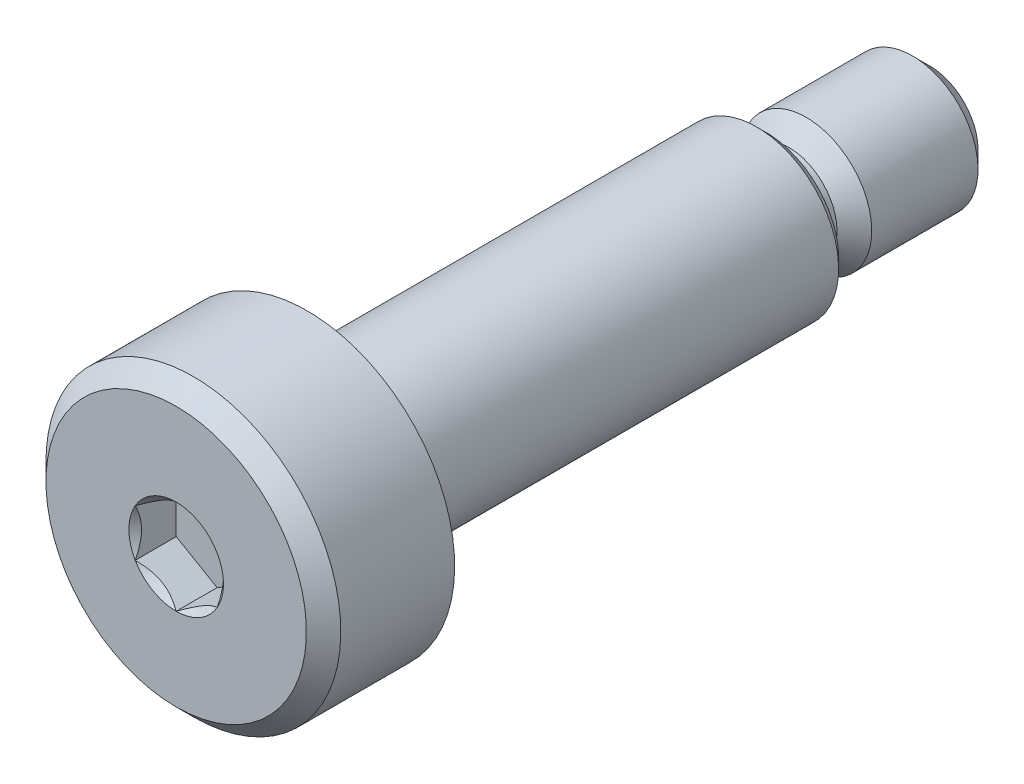
ISO-10303-21;
HEADER;
FILE_DESCRIPTION(('STEP AP214'),'2;1');
FILE_NAME('part.step','',(''),(''),'','','');
FILE_SCHEMA(('AUTOMOTIVE_DESIGN { 1 0 10303 214 1 1 1 1 }'));
ENDSEC;
DATA;
#1=APPLICATION_CONTEXT('core data for automotive mechanical design processes');
#2=APPLICATION_PROTOCOL_DEFINITION('international standard','automotive_design',2000,#1);
#3=PRODUCT_CONTEXT('',#1,'mechanical');
#4=PRODUCT('Part','Part','',(#3));
#5=PRODUCT_RELATED_PRODUCT_CATEGORY('part','',(#4));
#6=PRODUCT_DEFINITION_FORMATION('','',#4);
#7=PRODUCT_DEFINITION_CONTEXT('part definition',#1,'design');
#8=PRODUCT_DEFINITION('design','',#6,#7);
#9=PRODUCT_DEFINITION_SHAPE('','',#8);
#10=(LENGTH_UNIT() NAMED_UNIT(*) SI_UNIT(.MILLI.,.METRE.));
#11=(NAMED_UNIT(*) PLANE_ANGLE_UNIT() SI_UNIT($,.RADIAN.));
#12=(NAMED_UNIT(*) SI_UNIT($,.STERADIAN.) SOLID_ANGLE_UNIT());
#13=UNCERTAINTY_MEASURE_WITH_UNIT(LENGTH_MEASURE(1.E-05),#10,'distance_accuracy_value','');
#14=(GEOMETRIC_REPRESENTATION_CONTEXT(3) GLOBAL_UNCERTAINTY_ASSIGNED_CONTEXT((#13)) GLOBAL_UNIT_ASSIGNED_CONTEXT((#10,
#11,#12)) REPRESENTATION_CONTEXT('',''));
#15=CARTESIAN_POINT('',(0.,0.,0.));
#16=DIRECTION('',(0.,0.,1.));
#17=DIRECTION('',(1.,0.,0.));
#18=AXIS2_PLACEMENT_3D('',#15,#16,#17);
#19=CARTESIAN_POINT('',(0.,3.975,11.5));
#20=DIRECTION('',(0.,0.,-1.));
#21=DIRECTION('',(0.,1.,0.));
#22=AXIS2_PLACEMENT_3D('',#19,#20,#21);
#23=PLANE('',#22);
#24=CARTESIAN_POINT('',(0.,0.,11.5));
#25=DIRECTION('',(0.,0.,1.));
#26=DIRECTION('',(1.,0.,0.));
#27=AXIS2_PLACEMENT_3D('',#24,#25,#26);
#28=CIRCLE('',#27,1.44337567297406);
#29=CARTESIAN_POINT('',(0.,1.44337567297406,11.5));
#30=VERTEX_POINT('',#29);
#31=CARTESIAN_POINT('',(-1.24999999999998,0.721687836487042,11.5));
#32=VERTEX_POINT('',#31);
#33=EDGE_CURVE('E286',#30,#32,#28,.T.);
#34=ORIENTED_EDGE('',*,*,#33,.F.);
#35=CARTESIAN_POINT('',(1.25,0.721687836487011,11.5));
#36=VERTEX_POINT('',#35);
#37=EDGE_CURVE('E289',#36,#30,#28,.T.);
#38=ORIENTED_EDGE('',*,*,#37,.F.);
#39=CARTESIAN_POINT('',(1.25000000000002,-0.72168783648702,11.5));
#40=VERTEX_POINT('',#39);
#41=EDGE_CURVE('E48',#40,#36,#28,.T.);
#42=ORIENTED_EDGE('',*,*,#41,.F.);
#43=CARTESIAN_POINT('',(0.,-1.44337567297408,11.5));
#44=VERTEX_POINT('',#43);
#45=EDGE_CURVE('E55',#44,#40,#28,.T.);
#46=ORIENTED_EDGE('',*,*,#45,.F.);
#47=CARTESIAN_POINT('',(-1.25,-0.721687836487051,11.5));
#48=VERTEX_POINT('',#47);
#49=EDGE_CURVE('E294',#48,#44,#28,.T.);
#50=ORIENTED_EDGE('',*,*,#49,.F.);
#51=EDGE_CURVE('E291',#32,#48,#28,.T.);
#52=ORIENTED_EDGE('',*,*,#51,.F.);
#53=EDGE_LOOP('',(#34,#38,#42,#46,#50,#52));
#54=FACE_BOUND('',#53,.T.);
#55=CARTESIAN_POINT('',(0.,0.,11.5));
#56=DIRECTION('',(0.,0.,1.));
#57=DIRECTION('',(0.,-1.,0.));
#58=AXIS2_PLACEMENT_3D('',#55,#56,#57);
#59=CIRCLE('',#58,3.97500000000001);
#60=CARTESIAN_POINT('',(0.,-3.97500000000002,11.5));
#61=VERTEX_POINT('',#60);
#62=EDGE_CURVE('E11',#61,#61,#59,.T.);
#63=ORIENTED_EDGE('',*,*,#62,.T.);
#64=EDGE_LOOP('',(#63));
#65=FACE_BOUND('',#64,.T.);
#66=ADVANCED_FACE('F35',(#54,#65),#23,.F.);
#67=CARTESIAN_POINT('',(0.,0.,10.975));
#68=DIRECTION('',(0.,0.,-1.));
#69=DIRECTION('',(0.,1.,0.));
#70=AXIS2_PLACEMENT_3D('',#67,#68,#69);
#71=CONICAL_SURFACE('',#70,4.50000000000001,0.785398163397443);
#72=ORIENTED_EDGE('',*,*,#62,.F.);
#73=EDGE_LOOP('',(#72));
#74=FACE_BOUND('',#73,.T.);
#75=CARTESIAN_POINT('',(0.,0.,10.975));
#76=DIRECTION('',(0.,0.,1.));
#77=DIRECTION('',(0.,-1.,0.));
#78=AXIS2_PLACEMENT_3D('',#75,#76,#77);
#79=CIRCLE('',#78,4.50000000000001);
#80=CARTESIAN_POINT('',(0.,-4.50000000000002,10.975));
#81=VERTEX_POINT('',#80);
#82=EDGE_CURVE('E42',#81,#81,#79,.T.);
#83=ORIENTED_EDGE('',*,*,#82,.T.);
#84=EDGE_LOOP('',(#83));
#85=FACE_BOUND('',#84,.T.);
#86=ADVANCED_FACE('F185',(#74,#85),#71,.T.);
#87=CARTESIAN_POINT('',(0.,0.,11.5));
#88=DIRECTION('',(0.,0.,1.));
#89=DIRECTION('',(0.,-1.,0.));
#90=AXIS2_PLACEMENT_3D('',#87,#88,#89);
#91=CYLINDRICAL_SURFACE('',#90,4.50000000000001);
#92=ORIENTED_EDGE('',*,*,#82,.F.);
#93=EDGE_LOOP('',(#92));
#94=FACE_BOUND('',#93,.T.);
#95=CARTESIAN_POINT('',(0.,0.,7.5));
#96=DIRECTION('',(0.,0.,1.));
#97=DIRECTION('',(0.,-1.,0.));
#98=AXIS2_PLACEMENT_3D('',#95,#96,#97);
#99=CIRCLE('',#98,4.50000000000001);
#100=CARTESIAN_POINT('',(0.,-4.50000000000002,7.5));
#101=VERTEX_POINT('',#100);
#102=EDGE_CURVE('E180',#101,#101,#99,.T.);
#103=ORIENTED_EDGE('',*,*,#102,.T.);
#104=EDGE_LOOP('',(#103));
#105=FACE_BOUND('',#104,.T.);
#106=ADVANCED_FACE('F187',(#94,#105),#91,.T.);
#107=CARTESIAN_POINT('',(0.,4.5,7.5));
#108=DIRECTION('',(0.,0.,1.));
#109=DIRECTION('',(0.,-1.,0.));
#110=AXIS2_PLACEMENT_3D('',#107,#108,#109);
#111=PLANE('',#110);
#112=ORIENTED_EDGE('',*,*,#102,.F.);
#113=EDGE_LOOP('',(#112));
#114=FACE_BOUND('',#113,.T.);
#115=CARTESIAN_POINT('',(0.,0.,7.5));
#116=DIRECTION('',(0.,0.,1.));
#117=DIRECTION('',(0.,-1.,0.));
#118=AXIS2_PLACEMENT_3D('',#115,#116,#117);
#119=CIRCLE('',#118,2.50000000000001);
#120=CARTESIAN_POINT('',(0.,-2.50000000000002,7.5));
#121=VERTEX_POINT('',#120);
#122=EDGE_CURVE('E177',#121,#121,#119,.T.);
#123=ORIENTED_EDGE('',*,*,#122,.T.);
#124=EDGE_LOOP('',(#123));
#125=FACE_BOUND('',#124,.T.);
#126=ADVANCED_FACE('F190',(#114,#125),#111,.F.);
#127=CARTESIAN_POINT('',(0.,0.,7.26666666666667));
#128=DIRECTION('',(0.,0.,1.));
#129=DIRECTION('',(0.,-1.,0.));
#130=AXIS2_PLACEMENT_3D('',#127,#128,#129);
#131=TOROIDAL_SURFACE('',#130,2.50000000000001,0.233333333333333);
#132=ORIENTED_EDGE('',*,*,#122,.F.);
#133=EDGE_LOOP('',(#132));
#134=FACE_BOUND('',#133,.T.);
#135=CARTESIAN_POINT('',(0.,0.,7.26666666666667));
#136=DIRECTION('',(0.,0.,1.));
#137=DIRECTION('',(0.,-1.,0.));
#138=AXIS2_PLACEMENT_3D('',#135,#136,#137);
#139=CIRCLE('',#138,2.26666666666667);
#140=CARTESIAN_POINT('',(0.,-2.26666666666668,7.26666666666667));
#141=VERTEX_POINT('',#140);
#142=EDGE_CURVE('E174',#141,#141,#139,.T.);
#143=ORIENTED_EDGE('',*,*,#142,.T.);
#144=EDGE_LOOP('',(#143));
#145=FACE_BOUND('',#144,.T.);
#146=ADVANCED_FACE('F196',(#134,#145),#131,.F.);
#147=CARTESIAN_POINT('',(0.,0.,11.5));
#148=DIRECTION('',(0.,0.,1.));
#149=DIRECTION('',(0.,-1.,0.));
#150=AXIS2_PLACEMENT_3D('',#147,#148,#149);
#151=CYLINDRICAL_SURFACE('',#150,2.26666666666667);
#152=ORIENTED_EDGE('',*,*,#142,.F.);
#153=EDGE_LOOP('',(#152));
#154=FACE_BOUND('',#153,.T.);
#155=CARTESIAN_POINT('',(0.,0.,6.8));
#156=DIRECTION('',(0.,0.,1.));
#157=DIRECTION('',(0.,-1.,0.));
#158=AXIS2_PLACEMENT_3D('',#155,#156,#157);
#159=CIRCLE('',#158,2.26666666666667);
#160=CARTESIAN_POINT('',(0.,-2.26666666666668,6.8));
#161=VERTEX_POINT('',#160);
#162=EDGE_CURVE('E171',#161,#161,#159,.T.);
#163=ORIENTED_EDGE('',*,*,#162,.T.);
#164=EDGE_LOOP('',(#163));
#165=FACE_BOUND('',#164,.T.);
#166=ADVANCED_FACE('F202',(#154,#165),#151,.T.);
#167=CARTESIAN_POINT('',(0.,0.,6.66528493718909));
#168=DIRECTION('',(0.,0.,-1.));
#169=DIRECTION('',(0.,1.,0.));
#170=AXIS2_PLACEMENT_3D('',#167,#168,#169);
#171=CONICAL_SURFACE('',#170,2.50000000000001,1.0471975511966);
#172=ORIENTED_EDGE('',*,*,#162,.F.);
#173=EDGE_LOOP('',(#172));
#174=FACE_BOUND('',#173,.T.);
#175=CARTESIAN_POINT('',(0.,0.,6.66528493718909));
#176=DIRECTION('',(0.,0.,1.));
#177=DIRECTION('',(0.,-1.,0.));
#178=AXIS2_PLACEMENT_3D('',#175,#176,#177);
#179=CIRCLE('',#178,2.50000000000001);
#180=CARTESIAN_POINT('',(0.,-2.50000000000002,6.66528493718909));
#181=VERTEX_POINT('',#180);
#182=EDGE_CURVE('E168',#181,#181,#179,.T.);
#183=ORIENTED_EDGE('',*,*,#182,.T.);
#184=EDGE_LOOP('',(#183));
#185=FACE_BOUND('',#184,.T.);
#186=ADVANCED_FACE('F208',(#174,#185),#171,.T.);
#187=CARTESIAN_POINT('',(0.,0.,11.5));
#188=DIRECTION('',(0.,0.,1.));
#189=DIRECTION('',(0.,-1.,0.));
#190=AXIS2_PLACEMENT_3D('',#187,#188,#189);
#191=CYLINDRICAL_SURFACE('',#190,2.50000000000001);
#192=ORIENTED_EDGE('',*,*,#182,.F.);
#193=EDGE_LOOP('',(#192));
#194=FACE_BOUND('',#193,.T.);
#195=CARTESIAN_POINT('',(0.,0.,-6.22));
#196=DIRECTION('',(0.,0.,1.));
#197=DIRECTION('',(0.,-1.,0.));
#198=AXIS2_PLACEMENT_3D('',#195,#196,#197);
#199=CIRCLE('',#198,2.50000000000001);
#200=CARTESIAN_POINT('',(0.,-2.50000000000001,-6.22));
#201=VERTEX_POINT('',#200);
#202=EDGE_CURVE('E165',#201,#201,#199,.T.);
#203=ORIENTED_EDGE('',*,*,#202,.T.);
#204=EDGE_LOOP('',(#203));
#205=FACE_BOUND('',#204,.T.);
#206=ADVANCED_FACE('F214',(#194,#205),#191,.T.);
#207=CARTESIAN_POINT('',(0.,0.,-6.5));
#208=DIRECTION('',(0.,0.,1.));
#209=DIRECTION('',(0.,-1.,0.));
#210=AXIS2_PLACEMENT_3D('',#207,#208,#209);
#211=CONICAL_SURFACE('',#210,2.22000000000001,0.785398163397445);
#212=ORIENTED_EDGE('',*,*,#202,.F.);
#213=EDGE_LOOP('',(#212));
#214=FACE_BOUND('',#213,.T.);
#215=CARTESIAN_POINT('',(0.,0.,-6.5));
#216=DIRECTION('',(0.,0.,1.));
#217=DIRECTION('',(0.,-1.,0.));
#218=AXIS2_PLACEMENT_3D('',#215,#216,#217);
#219=CIRCLE('',#218,2.22000000000001);
#220=CARTESIAN_POINT('',(0.,-2.22000000000001,-6.5));
#221=VERTEX_POINT('',#220);
#222=EDGE_CURVE('E162',#221,#221,#219,.T.);
#223=ORIENTED_EDGE('',*,*,#222,.T.);
#224=EDGE_LOOP('',(#223));
#225=FACE_BOUND('',#224,.T.);
#226=ADVANCED_FACE('F220',(#214,#225),#211,.T.);
#227=CARTESIAN_POINT('',(0.,1.81955944018203,-6.5));
#228=DIRECTION('',(0.,0.,1.));
#229=DIRECTION('',(0.,-1.,0.));
#230=AXIS2_PLACEMENT_3D('',#227,#228,#229);
#231=PLANE('',#230);
#232=ORIENTED_EDGE('',*,*,#222,.F.);
#233=EDGE_LOOP('',(#232));
#234=FACE_BOUND('',#233,.T.);
#235=CARTESIAN_POINT('',(0.,0.,-6.5));
#236=DIRECTION('',(0.,0.,1.));
#237=DIRECTION('',(0.,-1.,0.));
#238=AXIS2_PLACEMENT_3D('',#235,#236,#237);
#239=CIRCLE('',#238,1.81955944018204);
#240=CARTESIAN_POINT('',(0.,-1.81955944018205,-6.5));
#241=VERTEX_POINT('',#240);
#242=EDGE_CURVE('E159',#241,#241,#239,.T.);
#243=ORIENTED_EDGE('',*,*,#242,.T.);
#244=EDGE_LOOP('',(#243));
#245=FACE_BOUND('',#244,.T.);
#246=ADVANCED_FACE('F226',(#234,#245),#231,.F.);
#247=CARTESIAN_POINT('',(0.,0.,-6.85));
#248=DIRECTION('',(0.,0.,1.));
#249=DIRECTION('',(0.,-1.,0.));
#250=AXIS2_PLACEMENT_3D('',#247,#248,#249);
#251=TOROIDAL_SURFACE('',#250,1.81955944018204,0.349999999999999);
#252=ORIENTED_EDGE('',*,*,#242,.F.);
#253=EDGE_LOOP('',(#252));
#254=FACE_BOUND('',#253,.T.);
#255=CARTESIAN_POINT('',(0.,0.,-6.85));
#256=DIRECTION('',(0.,0.,1.));
#257=DIRECTION('',(0.,-1.,0.));
#258=AXIS2_PLACEMENT_3D('',#255,#256,#257);
#259=CIRCLE('',#258,1.46955944018204);
#260=CARTESIAN_POINT('',(0.,-1.46955944018205,-6.85));
#261=VERTEX_POINT('',#260);
#262=EDGE_CURVE('E156',#261,#261,#259,.T.);
#263=ORIENTED_EDGE('',*,*,#262,.T.);
#264=EDGE_LOOP('',(#263));
#265=FACE_BOUND('',#264,.T.);
#266=ADVANCED_FACE('F232',(#254,#265),#251,.F.);
#267=CARTESIAN_POINT('',(0.,0.,11.5));
#268=DIRECTION('',(0.,0.,1.));
#269=DIRECTION('',(0.,-1.,0.));
#270=AXIS2_PLACEMENT_3D('',#267,#268,#269);
#271=CYLINDRICAL_SURFACE('',#270,1.46955944018204);
#272=ORIENTED_EDGE('',*,*,#262,.F.);
#273=EDGE_LOOP('',(#272));
#274=FACE_BOUND('',#273,.T.);
#275=CARTESIAN_POINT('',(0.,0.,-7.2));
#276=DIRECTION('',(0.,0.,1.));
#277=DIRECTION('',(0.,-1.,0.));
#278=AXIS2_PLACEMENT_3D('',#275,#276,#277);
#279=CIRCLE('',#278,1.46955944018204);
#280=CARTESIAN_POINT('',(0.,-1.46955944018205,-7.2));
#281=VERTEX_POINT('',#280);
#282=EDGE_CURVE('E153',#281,#281,#279,.T.);
#283=ORIENTED_EDGE('',*,*,#282,.T.);
#284=EDGE_LOOP('',(#283));
#285=FACE_BOUND('',#284,.T.);
#286=ADVANCED_FACE('F238',(#274,#285),#271,.T.);
#287=CARTESIAN_POINT('',(0.,0.,-7.73044055981796));
#288=DIRECTION('',(0.,0.,-1.));
#289=DIRECTION('',(0.,1.,0.));
#290=AXIS2_PLACEMENT_3D('',#287,#288,#289);
#291=CONICAL_SURFACE('',#290,2.,0.785398163397445);
#292=ORIENTED_EDGE('',*,*,#282,.F.);
#293=EDGE_LOOP('',(#292));
#294=FACE_BOUND('',#293,.T.);
#295=CARTESIAN_POINT('',(0.,0.,-7.73044055981796));
#296=DIRECTION('',(0.,0.,1.));
#297=DIRECTION('',(0.,-1.,0.));
#298=AXIS2_PLACEMENT_3D('',#295,#296,#297);
#299=CIRCLE('',#298,2.);
#300=CARTESIAN_POINT('',(0.,-2.00000000000001,-7.73044055981797));
#301=VERTEX_POINT('',#300);
#302=EDGE_CURVE('E150',#301,#301,#299,.T.);
#303=ORIENTED_EDGE('',*,*,#302,.T.);
#304=EDGE_LOOP('',(#303));
#305=FACE_BOUND('',#304,.T.);
#306=ADVANCED_FACE('F244',(#294,#305),#291,.T.);
#307=CARTESIAN_POINT('',(0.,0.,11.5));
#308=DIRECTION('',(0.,0.,1.));
#309=DIRECTION('',(0.,-1.,0.));
#310=AXIS2_PLACEMENT_3D('',#307,#308,#309);
#311=CYLINDRICAL_SURFACE('',#310,2.);
#312=ORIENTED_EDGE('',*,*,#302,.F.);
#313=EDGE_LOOP('',(#312));
#314=FACE_BOUND('',#313,.T.);
#315=CARTESIAN_POINT('',(0.,0.,-10.975));
#316=DIRECTION('',(0.,0.,1.));
#317=DIRECTION('',(0.,-1.,0.));
#318=AXIS2_PLACEMENT_3D('',#315,#316,#317);
#319=CIRCLE('',#318,2.);
#320=CARTESIAN_POINT('',(0.,-2.,-10.975));
#321=VERTEX_POINT('',#320);
#322=EDGE_CURVE('E147',#321,#321,#319,.T.);
#323=ORIENTED_EDGE('',*,*,#322,.T.);
#324=EDGE_LOOP('',(#323));
#325=FACE_BOUND('',#324,.T.);
#326=ADVANCED_FACE('F250',(#314,#325),#311,.T.);
#327=CARTESIAN_POINT('',(0.,0.,-11.5));
#328=DIRECTION('',(0.,0.,1.));
#329=DIRECTION('',(0.,-1.,0.));
#330=AXIS2_PLACEMENT_3D('',#327,#328,#329);
#331=CONICAL_SURFACE('',#330,1.475,0.785398163397443);
#332=ORIENTED_EDGE('',*,*,#322,.F.);
#333=EDGE_LOOP('',(#332));
#334=FACE_BOUND('',#333,.T.);
#335=CARTESIAN_POINT('',(0.,0.,-11.5));
#336=DIRECTION('',(0.,0.,1.));
#337=DIRECTION('',(0.,-1.,0.));
#338=AXIS2_PLACEMENT_3D('',#335,#336,#337);
#339=CIRCLE('',#338,1.475);
#340=CARTESIAN_POINT('',(0.,-1.47500000000001,-11.5));
#341=VERTEX_POINT('',#340);
#342=EDGE_CURVE('E134',#341,#341,#339,.T.);
#343=ORIENTED_EDGE('',*,*,#342,.T.);
#344=EDGE_LOOP('',(#343));
#345=FACE_BOUND('',#344,.T.);
#346=ADVANCED_FACE('F256',(#334,#345),#331,.T.);
#347=CARTESIAN_POINT('',(0.,0.,-11.5));
#348=DIRECTION('',(0.,0.,1.));
#349=DIRECTION('',(0.,-1.,0.));
#350=AXIS2_PLACEMENT_3D('',#347,#348,#349);
#351=PLANE('',#350);
#352=ORIENTED_EDGE('',*,*,#342,.F.);
#353=EDGE_LOOP('',(#352));
#354=FACE_BOUND('',#353,.T.);
#355=ADVANCED_FACE('F262',(#354),#351,.F.);
#356=CARTESIAN_POINT('',(0.,0.,11.5));
#357=DIRECTION('',(0.,0.,1.));
#358=DIRECTION('',(1.,0.,0.));
#359=AXIS2_PLACEMENT_3D('',#356,#357,#358);
#360=CONICAL_SURFACE('',#359,1.44337567297406,0.78539816339745);
#361=ORIENTED_EDGE('',*,*,#33,.T.);
#362=CARTESIAN_POINT('',(0.000199999999998604,1.4434911430279,11.5001154839092));
#363=CARTESIAN_POINT('',(-0.0427751670715886,1.41867941875065,11.4753216680551));
#364=CARTESIAN_POINT('',(-0.0864690047459502,1.39345276980743,11.4519837344187));
#365=CARTESIAN_POINT('',(-0.175565930841945,1.34201263554194,11.4092520040846));
#366=CARTESIAN_POINT('',(-0.220977498357067,1.31579425481276,11.3898819923604));
#367=CARTESIAN_POINT('',(-0.312547820935264,1.26292610442246,11.3567004834135));
#368=CARTESIAN_POINT('',(-0.35868324017589,1.23628980770471,11.3428055590527));
#369=CARTESIAN_POINT('',(-0.451970080407597,1.18243062538508,11.3213972821607));
#370=CARTESIAN_POINT('',(-0.499118649136385,1.15520938653761,11.3138679415668));
#371=CARTESIAN_POINT('',(-0.580373556887258,1.10829684367466,11.3070744980507));
#372=CARTESIAN_POINT('',(-0.614374876627947,1.08866617256957,11.3060685591044));
#373=CARTESIAN_POINT('',(-0.682317764432485,1.0494393280061,11.3077614149113));
#374=CARTESIAN_POINT('',(-0.716259317655665,1.02984316311599,11.3104610272156));
#375=CARTESIAN_POINT('',(-0.783814856457508,0.990839954603493,11.3194089303164));
#376=CARTESIAN_POINT('',(-0.817428507286784,0.971433104248764,11.3256605258997));
#377=CARTESIAN_POINT('',(-0.884094638217823,0.932943395609898,11.3413756814139));
#378=CARTESIAN_POINT('',(-0.917146871030305,0.913860680098293,11.3508406200875));
#379=CARTESIAN_POINT('',(-1.00179969160027,0.864986351354561,11.3789313906876));
#380=CARTESIAN_POINT('',(-1.05286649242964,0.835502920149071,11.3996701574522));
#381=CARTESIAN_POINT('',(-1.15300085411326,0.777690319475905,11.4463871346715));
#382=CARTESIAN_POINT('',(-1.20207431157827,0.749357745598414,11.4723482959468));
#383=CARTESIAN_POINT('',(-1.2502,0.721572366433193,11.5001154839091));
#384=B_SPLINE_CURVE_WITH_KNOTS('',3,(#362,#363,#364,#365,#366,#367,#368,#369,#370,#371,#372,
#373,#374,#375,#376,#377,#378,#379,#380,#381,#382,#383),.UNSPECIFIED.,.F.,.F.,(4,2,2,2,2,2,2,2,
2,2,4),(0.,0.166533409618305,0.334037607289764,0.498880396489702,0.66330791924028,
0.780963963458833,0.898645970148461,1.01643764860774,1.13427993171551,1.32148652032141,
1.50809158792573),.UNSPECIFIED.);
#385=EDGE_CURVE('E293',#30,#32,#384,.T.);
#386=ORIENTED_EDGE('',*,*,#385,.F.);
#387=EDGE_LOOP('',(#361,#386));
#388=FACE_BOUND('',#387,.T.);
#389=ADVANCED_FACE('F267',(#388),#360,.F.);
#390=ORIENTED_EDGE('',*,*,#51,.T.);
#391=CARTESIAN_POINT('',(-1.25,-1.45844245505819,11.9774456083314));
#392=CARTESIAN_POINT('',(-1.25,-1.42301517782604,11.9505504331684));
#393=CARTESIAN_POINT('',(-1.25,-1.38739259471813,11.9239132721643));
#394=CARTESIAN_POINT('',(-1.25,-1.31567681688476,11.8712620842442));
#395=CARTESIAN_POINT('',(-1.25,-1.27958350821522,11.8452482126937));
#396=CARTESIAN_POINT('',(-1.25,-1.16994919906755,11.7679309253239));
#397=CARTESIAN_POINT('',(-1.25,-1.09559207117151,11.7177657157311));
#398=CARTESIAN_POINT('',(-1.25,-0.939543616744097,11.6191087372188));
#399=CARTESIAN_POINT('',(-1.25,-0.857678207866027,11.5708892555275));
#400=CARTESIAN_POINT('',(-1.25,-0.689834311085131,11.4825626076919));
#401=CARTESIAN_POINT('',(-1.25,-0.603870962043201,11.4424280706784));
#402=CARTESIAN_POINT('',(-1.25,-0.47502099054951,11.3933215537189));
#403=CARTESIAN_POINT('',(-1.25,-0.43408262636186,11.3792601333163));
#404=CARTESIAN_POINT('',(-1.25,-0.351200868158825,11.3544217225875));
#405=CARTESIAN_POINT('',(-1.25,-0.309257406716582,11.343644953281));
#406=CARTESIAN_POINT('',(-1.25,-0.22532618247008,11.3261206573077));
#407=CARTESIAN_POINT('',(-1.25,-0.183353314948822,11.319302916863));
#408=CARTESIAN_POINT('',(-1.25,-0.0989376095367877,11.3098328899205));
#409=CARTESIAN_POINT('',(-1.25,-0.0564948584126027,11.3071798468942));
#410=CARTESIAN_POINT('',(-1.25,0.0268119063323923,11.3062444970806));
#411=CARTESIAN_POINT('',(-1.25,0.0676741326530964,11.3077986975234));
#412=CARTESIAN_POINT('',(-1.25,0.149061479525303,11.3148272348816));
#413=CARTESIAN_POINT('',(-1.25,0.189586535119568,11.3203023102525));
#414=CARTESIAN_POINT('',(-1.25,0.27068678781888,11.3349634522043));
#415=CARTESIAN_POINT('',(-1.25,0.311250298408257,11.3442131770672));
#416=CARTESIAN_POINT('',(-1.25,0.391488499706744,11.3659262751041));
#417=CARTESIAN_POINT('',(-1.25,0.431163257835265,11.3783894036108));
#418=CARTESIAN_POINT('',(-1.25,0.555216398704208,11.4220700828824));
#419=CARTESIAN_POINT('',(-1.25,0.637851220281927,11.4582264978976));
#420=CARTESIAN_POINT('',(-1.25,0.799246338610346,11.5386395441542));
#421=CARTESIAN_POINT('',(-1.25,0.877991480837636,11.5829251047261));
#422=CARTESIAN_POINT('',(-1.25,1.02849676118733,11.6743156913958));
#423=CARTESIAN_POINT('',(-1.25,1.10040966869699,11.7211722627457));
#424=CARTESIAN_POINT('',(-1.25,1.20635851538069,11.7936186777052));
#425=CARTESIAN_POINT('',(-1.25,1.2412179871426,11.8180250606184));
#426=CARTESIAN_POINT('',(-1.25,1.31045998194067,11.8674862455047));
#427=CARTESIAN_POINT('',(-1.25,1.34484263274746,11.8925408684067));
#428=CARTESIAN_POINT('',(-1.25,1.37902663149297,11.9178643573194));
#429=B_SPLINE_CURVE_WITH_KNOTS('',3,(#391,#392,#393,#394,#395,#396,#397,#398,#399,#400,#401,
#402,#403,#404,#405,#406,#407,#408,#409,#410,#411,#412,#413,#414,#415,#416,#417,#418,#419,#420,
#421,#422,#423,#424,#425,#426,#427,#428),.UNSPECIFIED.,.F.,.F.,(4,2,2,2,2,2,2,2,2,2,2,2,2,2,2,2,
2,2,4),(0.,0.133435720650652,0.26690436349589,0.535877392907816,0.820681861155797,
1.10450531666899,1.23425377884955,1.36401096969689,1.49139047404654,1.61874683688834,
1.74122590042979,1.86372803767965,1.98838763303931,2.11303773966678,2.38284177069341,
2.65362525833967,2.91099066489612,3.03864814262749,3.16627072479097),.UNSPECIFIED.);
#430=EDGE_CURVE('E302',#32,#48,#429,.F.);
#431=ORIENTED_EDGE('',*,*,#430,.F.);
#432=EDGE_LOOP('',(#390,#431));
#433=FACE_BOUND('',#432,.T.);
#434=ADVANCED_FACE('F272',(#433),#360,.F.);
#435=ORIENTED_EDGE('',*,*,#49,.T.);
#436=CARTESIAN_POINT('',(-1.2502,-0.721572366433193,11.5001154839091));
#437=CARTESIAN_POINT('',(-1.20722483292841,-0.746384090710443,11.4753216680551));
#438=CARTESIAN_POINT('',(-1.16353099525405,-0.771610739653663,11.4519837344187));
#439=CARTESIAN_POINT('',(-1.07443406915806,-0.823050873919154,11.4092520040845));
#440=CARTESIAN_POINT('',(-1.02902250164293,-0.849269254648333,11.3898819923604));
#441=CARTESIAN_POINT('',(-0.937452179064736,-0.902137405038636,11.3567004834135));
#442=CARTESIAN_POINT('',(-0.891316759824109,-0.928773701756388,11.3428055590526));
#443=CARTESIAN_POINT('',(-0.798029919592401,-0.982632884076014,11.3213972821606));
#444=CARTESIAN_POINT('',(-0.750881350863613,-1.00985412292349,11.3138679415668));
#445=CARTESIAN_POINT('',(-0.669626443112741,-1.05676666578643,11.3070744980507));
#446=CARTESIAN_POINT('',(-0.635625123372053,-1.07639733689152,11.3060685591043));
#447=CARTESIAN_POINT('',(-0.567682235567517,-1.11562418145499,11.3077614149113));
#448=CARTESIAN_POINT('',(-0.533740682344337,-1.1352203463451,11.3104610272155));
#449=CARTESIAN_POINT('',(-0.466185143542496,-1.1742235548576,11.3194089303164));
#450=CARTESIAN_POINT('',(-0.432571492713221,-1.19363040521233,11.3256605258997));
#451=CARTESIAN_POINT('',(-0.365905361782184,-1.23212011385119,11.3413756814139));
#452=CARTESIAN_POINT('',(-0.332853128969702,-1.2512028293628,11.3508406200874));
#453=CARTESIAN_POINT('',(-0.248200308399734,-1.30007715810653,11.3789313906876));
#454=CARTESIAN_POINT('',(-0.197133507570361,-1.32956058931202,11.3996701574522));
#455=CARTESIAN_POINT('',(-0.0969991458867444,-1.38737318998519,11.4463871346715));
#456=CARTESIAN_POINT('',(-0.04792568842173,-1.41570576386268,11.4723482959467));
#457=CARTESIAN_POINT('',(0.000199999999999994,-1.4434911430279,11.5001154839091));
#458=B_SPLINE_CURVE_WITH_KNOTS('',3,(#436,#437,#438,#439,#440,#441,#442,#443,#444,#445,#446,
#447,#448,#449,#450,#451,#452,#453,#454,#455,#456,#457),.UNSPECIFIED.,.F.,.F.,(4,2,2,2,2,2,2,2,
2,2,4),(0.,0.166533409618306,0.334037607289767,0.498880396489706,0.663307919240284,
0.780963963458835,0.898645970148459,1.01643764860774,1.1342799317155,1.32148652032141,
1.50809158792574),.UNSPECIFIED.);
#459=EDGE_CURVE('E321',#48,#44,#458,.T.);
#460=ORIENTED_EDGE('',*,*,#459,.F.);
#461=EDGE_LOOP('',(#435,#460));
#462=FACE_BOUND('',#461,.T.);
#463=ADVANCED_FACE('F365',(#462),#360,.F.);
#464=ORIENTED_EDGE('',*,*,#45,.T.);
#465=CARTESIAN_POINT('',(-0.000199999999999229,-1.4434911430279,11.5001154839091));
#466=CARTESIAN_POINT('',(0.042775167071587,-1.41867941875065,11.4753216680551));
#467=CARTESIAN_POINT('',(0.0864690047459476,-1.39345276980743,11.4519837344187));
#468=CARTESIAN_POINT('',(0.17556593084194,-1.34201263554194,11.4092520040845));
#469=CARTESIAN_POINT('',(0.220977498357061,-1.31579425481276,11.3898819923604));
#470=CARTESIAN_POINT('',(0.312547820935255,-1.26292610442246,11.3567004834135));
#471=CARTESIAN_POINT('',(0.35868324017588,-1.23628980770471,11.3428055590526));
#472=CARTESIAN_POINT('',(0.451970080407585,-1.18243062538509,11.3213972821606));
#473=CARTESIAN_POINT('',(0.499118649136371,-1.15520938653762,11.3138679415668));
#474=CARTESIAN_POINT('',(0.580373556887243,-1.10829684367467,11.3070744980507));
#475=CARTESIAN_POINT('',(0.614374876627931,-1.08866617256958,11.3060685591043));
#476=CARTESIAN_POINT('',(0.682317764432466,-1.04943932800611,11.3077614149113));
#477=CARTESIAN_POINT('',(0.716259317655646,-1.029843163116,11.3104610272155));
#478=CARTESIAN_POINT('',(0.783814856457487,-0.990839954603504,11.3194089303164));
#479=CARTESIAN_POINT('',(0.817428507286761,-0.971433104248776,11.3256605258997));
#480=CARTESIAN_POINT('',(0.884094638217798,-0.932943395609911,11.3413756814139));
#481=CARTESIAN_POINT('',(0.91714687103028,-0.913860680098307,11.3508406200874));
#482=CARTESIAN_POINT('',(1.00179969160025,-0.864986351354573,11.3789313906876));
#483=CARTESIAN_POINT('',(1.05286649242963,-0.83550292014908,11.3996701574522));
#484=CARTESIAN_POINT('',(1.15300085411325,-0.777690319475909,11.4463871346715));
#485=CARTESIAN_POINT('',(1.20207431157827,-0.749357745598416,11.4723482959468));
#486=CARTESIAN_POINT('',(1.2502,-0.721572366433193,11.5001154839091));
#487=B_SPLINE_CURVE_WITH_KNOTS('',3,(#465,#466,#467,#468,#469,#470,#471,#472,#473,#474,#475,
#476,#477,#478,#479,#480,#481,#482,#483,#484,#485,#486),.UNSPECIFIED.,.F.,.F.,(4,2,2,2,2,2,2,2,
2,2,4),(0.,0.166533409618301,0.334037607289756,0.498880396489689,0.663307919240262,
0.780963963458813,0.898645970148437,1.01643764860772,1.13427993171548,1.3214865203214,
1.50809158792573),.UNSPECIFIED.);
#488=EDGE_CURVE('E328',#44,#40,#487,.T.);
#489=ORIENTED_EDGE('',*,*,#488,.F.);
#490=EDGE_LOOP('',(#464,#489));
#491=FACE_BOUND('',#490,.T.);
#492=ADVANCED_FACE('F366',(#491),#360,.F.);
#493=ORIENTED_EDGE('',*,*,#41,.T.);
#494=CARTESIAN_POINT('',(1.25,-1.45844245513023,11.9774456083861));
#495=CARTESIAN_POINT('',(1.25,-1.42301517789604,11.950550433221));
#496=CARTESIAN_POINT('',(1.25,-1.38739259478608,11.9239132722148));
#497=CARTESIAN_POINT('',(1.25,-1.31567681694861,11.8712620842905));
#498=CARTESIAN_POINT('',(1.25,-1.279583508277,11.8452482127379));
#499=CARTESIAN_POINT('',(1.25,-1.16994919912301,11.7679309253618));
#500=CARTESIAN_POINT('',(1.25,-1.09559207122267,11.7177657157648));
#501=CARTESIAN_POINT('',(1.25,-0.939543616785884,11.6191087372439));
#502=CARTESIAN_POINT('',(1.25,-0.857678207902712,11.5708892555481));
#503=CARTESIAN_POINT('',(1.25,-0.689834311111181,11.4825626077043));
#504=CARTESIAN_POINT('',(1.25,-0.603870962063721,11.442428070687));
#505=CARTESIAN_POINT('',(1.25,-0.475020990565877,11.3933215537247));
#506=CARTESIAN_POINT('',(1.25,-0.434082626379985,11.3792601333223));
#507=CARTESIAN_POINT('',(1.25,-0.351200868180523,11.3544217225935));
#508=CARTESIAN_POINT('',(1.25,-0.309257406740096,11.3436449532867));
#509=CARTESIAN_POINT('',(1.25,-0.225326182497169,11.3261206573125));
#510=CARTESIAN_POINT('',(1.25,-0.183353314977669,11.3193029168672));
#511=CARTESIAN_POINT('',(1.25,-0.0989376095690945,11.3098328899231));
#512=CARTESIAN_POINT('',(1.25,-0.0564948584466115,11.3071798468958));
#513=CARTESIAN_POINT('',(1.25,0.0268119062953166,11.3062444970798));
#514=CARTESIAN_POINT('',(1.25,0.0676741326146515,11.3077986975213));
#515=CARTESIAN_POINT('',(1.25,0.149061479484259,11.3148272348768));
#516=CARTESIAN_POINT('',(1.25,0.189586535077295,11.3203023102461));
#517=CARTESIAN_POINT('',(1.25,0.27068678777418,11.3349634521949));
#518=CARTESIAN_POINT('',(1.25,0.311250298362364,11.3442131770561));
#519=CARTESIAN_POINT('',(1.25,0.391488499658584,11.3659262750897));
#520=CARTESIAN_POINT('',(1.25,0.431163257786031,11.3783894035947));
#521=CARTESIAN_POINT('',(1.25,0.555216398644331,11.4220700828585));
#522=CARTESIAN_POINT('',(1.25,0.637851220213015,11.4582264978665));
#523=CARTESIAN_POINT('',(1.25,0.799246338524058,11.538639544108));
#524=CARTESIAN_POINT('',(1.25,0.877991480743012,11.5829251046718));
#525=CARTESIAN_POINT('',(1.25,1.02849676107772,11.6743156913262));
#526=CARTESIAN_POINT('',(1.25,1.10040966858068,11.7211722626689));
#527=CARTESIAN_POINT('',(1.25,1.20635851525448,11.7936186776176));
#528=CARTESIAN_POINT('',(1.25,1.24121798701314,11.8180250605272));
#529=CARTESIAN_POINT('',(1.25,1.31045998180472,11.8674862454063));
#530=CARTESIAN_POINT('',(1.25,1.34484263260829,11.8925408683047));
#531=CARTESIAN_POINT('',(1.25,1.37902663135057,11.9178643572139));
#532=B_SPLINE_CURVE_WITH_KNOTS('',3,(#494,#495,#496,#497,#498,#499,#500,#501,#502,#503,#504,
#505,#506,#507,#508,#509,#510,#511,#512,#513,#514,#515,#516,#517,#518,#519,#520,#521,#522,#523,
#524,#525,#526,#527,#528,#529,#530,#531),.UNSPECIFIED.,.F.,.F.,(4,2,2,2,2,2,2,2,2,2,2,2,2,2,2,2,
2,2,4),(0.,0.133435720659353,0.266904363513291,0.535877392942945,0.820681861210828,
1.10450531674373,1.23425377891919,1.36401096976144,1.49139047410621,1.61874683694314,
1.74122590048035,1.86372803772597,1.98838763308105,2.11303773970394,2.38284177069723,
2.65362525830993,2.91099066483768,3.0386481425549,3.16627072470423),.UNSPECIFIED.);
#533=EDGE_CURVE('E115',#40,#36,#532,.T.);
#534=ORIENTED_EDGE('',*,*,#533,.F.);
#535=EDGE_LOOP('',(#493,#534));
#536=FACE_BOUND('',#535,.T.);
#537=ADVANCED_FACE('F313',(#536),#360,.F.);
#538=ORIENTED_EDGE('',*,*,#37,.T.);
#539=CARTESIAN_POINT('',(1.2502,0.721572366433194,11.5001154839091));
#540=CARTESIAN_POINT('',(1.20722483292841,0.746384090710444,11.4753216680551));
#541=CARTESIAN_POINT('',(1.16353099525405,0.771610739653664,11.4519837344187));
#542=CARTESIAN_POINT('',(1.07443406915806,0.823050873919154,11.4092520040845));
#543=CARTESIAN_POINT('',(1.02902250164294,0.849269254648332,11.3898819923604));
#544=CARTESIAN_POINT('',(0.937452179064741,0.902137405038634,11.3567004834135));
#545=CARTESIAN_POINT('',(0.891316759824115,0.928773701756385,11.3428055590527));
#546=CARTESIAN_POINT('',(0.79802991959241,0.982632884076009,11.3213972821607));
#547=CARTESIAN_POINT('',(0.750881350863623,1.00985412292348,11.3138679415668));
#548=CARTESIAN_POINT('',(0.669626443112751,1.05676666578642,11.3070744980507));
#549=CARTESIAN_POINT('',(0.635625123372062,1.07639733689151,11.3060685591044));
#550=CARTESIAN_POINT('',(0.567682235567525,1.11562418145498,11.3077614149113));
#551=CARTESIAN_POINT('',(0.533740682344344,1.1352203463451,11.3104610272156));
#552=CARTESIAN_POINT('',(0.466185143542501,1.17422355485759,11.3194089303164));
#553=CARTESIAN_POINT('',(0.432571492713226,1.19363040521232,11.3256605258997));
#554=CARTESIAN_POINT('',(0.365905361782187,1.23212011385119,11.3413756814139));
#555=CARTESIAN_POINT('',(0.332853128969704,1.25120282936279,11.3508406200875));
#556=CARTESIAN_POINT('',(0.248200308399735,1.30007715810653,11.3789313906876));
#557=CARTESIAN_POINT('',(0.197133507570361,1.32956058931202,11.3996701574522));
#558=CARTESIAN_POINT('',(0.0969991458867436,1.38737318998519,11.4463871346715));
#559=CARTESIAN_POINT('',(0.0479256884217287,1.41570576386268,11.4723482959468));
#560=CARTESIAN_POINT('',(-0.000200000000001723,1.4434911430279,11.5001154839092));
#561=B_SPLINE_CURVE_WITH_KNOTS('',3,(#539,#540,#541,#542,#543,#544,#545,#546,#547,#548,#549,
#550,#551,#552,#553,#554,#555,#556,#557,#558,#559,#560),.UNSPECIFIED.,.F.,.F.,(4,2,2,2,2,2,2,2,
2,2,4),(0.,0.166533409618302,0.334037607289758,0.498880396489692,0.663307919240266,
0.780963963458819,0.898645970148447,1.01643764860773,1.13427993171549,1.3214865203214,
1.50809158792573),.UNSPECIFIED.);
#562=EDGE_CURVE('E95',#36,#30,#561,.T.);
#563=ORIENTED_EDGE('',*,*,#562,.F.);
#564=EDGE_LOOP('',(#538,#563));
#565=FACE_BOUND('',#564,.T.);
#566=ADVANCED_FACE('F274',(#565),#360,.F.);
#567=CARTESIAN_POINT('',(0.,0.,10.25));
#568=DIRECTION('',(0.,0.,1.));
#569=DIRECTION('',(1.,0.,0.));
#570=AXIS2_PLACEMENT_3D('',#567,#568,#569);
#571=PLANE('',#570);
#572=DIRECTION('',(-0.866025403784439,0.499999999999999,0.));
#573=VECTOR('',#572,1.);
#574=CARTESIAN_POINT('',(1.25,0.721687836487032,10.25));
#575=LINE('',#574,#573);
#576=CARTESIAN_POINT('',(1.25,0.721687836487032,10.25));
#577=VERTEX_POINT('',#576);
#578=CARTESIAN_POINT('',(0.,1.44337567297406,10.25));
#579=VERTEX_POINT('',#578);
#580=EDGE_CURVE('E93',#577,#579,#575,.T.);
#581=ORIENTED_EDGE('',*,*,#580,.T.);
#582=DIRECTION('',(-0.866025403784439,-0.5,0.));
#583=VECTOR('',#582,1.);
#584=CARTESIAN_POINT('',(0.,1.44337567297406,10.25));
#585=LINE('',#584,#583);
#586=CARTESIAN_POINT('',(-1.25,0.721687836487031,10.25));
#587=VERTEX_POINT('',#586);
#588=EDGE_CURVE('E103',#579,#587,#585,.T.);
#589=ORIENTED_EDGE('',*,*,#588,.T.);
#590=DIRECTION('',(0.,-1.,0.));
#591=VECTOR('',#590,1.);
#592=CARTESIAN_POINT('',(-1.25,0.721687836487031,10.25));
#593=LINE('',#592,#591);
#594=CARTESIAN_POINT('',(-1.25,-0.721687836487031,10.25));
#595=VERTEX_POINT('',#594);
#596=EDGE_CURVE('E109',#587,#595,#593,.T.);
#597=ORIENTED_EDGE('',*,*,#596,.T.);
#598=DIRECTION('',(0.866025403784439,-0.5,0.));
#599=VECTOR('',#598,1.);
#600=CARTESIAN_POINT('',(-1.25,-0.721687836487031,10.25));
#601=LINE('',#600,#599);
#602=CARTESIAN_POINT('',(0.,-1.44337567297406,10.25));
#603=VERTEX_POINT('',#602);
#604=EDGE_CURVE('E126',#595,#603,#601,.T.);
#605=ORIENTED_EDGE('',*,*,#604,.T.);
#606=DIRECTION('',(0.866025403784438,0.5,0.));
#607=VECTOR('',#606,1.);
#608=CARTESIAN_POINT('',(0.,-1.44337567297406,10.25));
#609=LINE('',#608,#607);
#610=CARTESIAN_POINT('',(1.25,-0.72168783648703,10.25));
#611=VERTEX_POINT('',#610);
#612=EDGE_CURVE('E129',#603,#611,#609,.T.);
#613=ORIENTED_EDGE('',*,*,#612,.T.);
#614=DIRECTION('',(0.,1.,0.));
#615=VECTOR('',#614,1.);
#616=CARTESIAN_POINT('',(1.25,-0.72168783648703,10.25));
#617=LINE('',#616,#615);
#618=EDGE_CURVE('E100',#611,#577,#617,.T.);
#619=ORIENTED_EDGE('',*,*,#618,.T.);
#620=EDGE_LOOP('',(#581,#589,#597,#605,#613,#619));
#621=FACE_BOUND('',#620,.T.);
#622=ADVANCED_FACE('F111',(#621),#571,.T.);
#623=CARTESIAN_POINT('',(0.,1.44337567297406,10.25));
#624=DIRECTION('',(-0.5,0.866025403784438,0.));
#625=DIRECTION('',(-0.866025403784438,-0.5,0.));
#626=AXIS2_PLACEMENT_3D('',#623,#624,#625);
#627=PLANE('',#626);
#628=DIRECTION('',(0.,0.,1.));
#629=VECTOR('',#628,1.);
#630=CARTESIAN_POINT('',(0.,1.44337567297406,10.25));
#631=LINE('',#630,#629);
#632=EDGE_CURVE('E88',#579,#30,#631,.T.);
#633=ORIENTED_EDGE('',*,*,#632,.T.);
#634=ORIENTED_EDGE('',*,*,#385,.T.);
#635=DIRECTION('',(0.,0.,1.));
#636=VECTOR('',#635,1.);
#637=CARTESIAN_POINT('',(-1.25,0.721687836487031,10.25));
#638=LINE('',#637,#636);
#639=EDGE_CURVE('E99',#587,#32,#638,.T.);
#640=ORIENTED_EDGE('',*,*,#639,.F.);
#641=ORIENTED_EDGE('',*,*,#588,.F.);
#642=EDGE_LOOP('',(#633,#634,#640,#641));
#643=FACE_BOUND('',#642,.T.);
#644=ADVANCED_FACE('F104',(#643),#627,.F.);
#645=CARTESIAN_POINT('',(-1.25,0.721687836487031,10.25));
#646=DIRECTION('',(-1.,0.,0.));
#647=DIRECTION('',(0.,-1.,0.));
#648=AXIS2_PLACEMENT_3D('',#645,#646,#647);
#649=PLANE('',#648);
#650=ORIENTED_EDGE('',*,*,#639,.T.);
#651=ORIENTED_EDGE('',*,*,#430,.T.);
#652=DIRECTION('',(0.,0.,1.));
#653=VECTOR('',#652,1.);
#654=CARTESIAN_POINT('',(-1.25,-0.721687836487031,10.25));
#655=LINE('',#654,#653);
#656=EDGE_CURVE('E141',#595,#48,#655,.T.);
#657=ORIENTED_EDGE('',*,*,#656,.F.);
#658=ORIENTED_EDGE('',*,*,#596,.F.);
#659=EDGE_LOOP('',(#650,#651,#657,#658));
#660=FACE_BOUND('',#659,.T.);
#661=ADVANCED_FACE('F350',(#660),#649,.F.);
#662=CARTESIAN_POINT('',(-1.25,-0.721687836487031,10.25));
#663=DIRECTION('',(-0.5,-0.866025403784439,0.));
#664=DIRECTION('',(0.866025403784439,-0.5,0.));
#665=AXIS2_PLACEMENT_3D('',#662,#663,#664);
#666=PLANE('',#665);
#667=ORIENTED_EDGE('',*,*,#656,.T.);
#668=ORIENTED_EDGE('',*,*,#459,.T.);
#669=DIRECTION('',(0.,0.,1.));
#670=VECTOR('',#669,1.);
#671=CARTESIAN_POINT('',(0.,-1.44337567297406,10.25));
#672=LINE('',#671,#670);
#673=EDGE_CURVE('E138',#603,#44,#672,.T.);
#674=ORIENTED_EDGE('',*,*,#673,.F.);
#675=ORIENTED_EDGE('',*,*,#604,.F.);
#676=EDGE_LOOP('',(#667,#668,#674,#675));
#677=FACE_BOUND('',#676,.T.);
#678=ADVANCED_FACE('F346',(#677),#666,.F.);
#679=CARTESIAN_POINT('',(0.,-1.44337567297406,10.25));
#680=DIRECTION('',(0.5,-0.866025403784438,0.));
#681=DIRECTION('',(0.866025403784438,0.5,0.));
#682=AXIS2_PLACEMENT_3D('',#679,#680,#681);
#683=PLANE('',#682);
#684=ORIENTED_EDGE('',*,*,#673,.T.);
#685=ORIENTED_EDGE('',*,*,#488,.T.);
#686=DIRECTION('',(0.,0.,1.));
#687=VECTOR('',#686,1.);
#688=CARTESIAN_POINT('',(1.25,-0.72168783648703,10.25));
#689=LINE('',#688,#687);
#690=EDGE_CURVE('E135',#611,#40,#689,.T.);
#691=ORIENTED_EDGE('',*,*,#690,.F.);
#692=ORIENTED_EDGE('',*,*,#612,.F.);
#693=EDGE_LOOP('',(#684,#685,#691,#692));
#694=FACE_BOUND('',#693,.T.);
#695=ADVANCED_FACE('F342',(#694),#683,.F.);
#696=CARTESIAN_POINT('',(1.25,-0.72168783648703,10.25));
#697=DIRECTION('',(1.,0.,0.));
#698=DIRECTION('',(0.,1.,0.));
#699=AXIS2_PLACEMENT_3D('',#696,#697,#698);
#700=PLANE('',#699);
#701=ORIENTED_EDGE('',*,*,#690,.T.);
#702=ORIENTED_EDGE('',*,*,#533,.T.);
#703=DIRECTION('',(0.,0.,1.));
#704=VECTOR('',#703,1.);
#705=CARTESIAN_POINT('',(1.25,0.721687836487032,10.25));
#706=LINE('',#705,#704);
#707=EDGE_CURVE('E132',#577,#36,#706,.T.);
#708=ORIENTED_EDGE('',*,*,#707,.F.);
#709=ORIENTED_EDGE('',*,*,#618,.F.);
#710=EDGE_LOOP('',(#701,#702,#708,#709));
#711=FACE_BOUND('',#710,.T.);
#712=ADVANCED_FACE('F339',(#711),#700,.F.);
#713=CARTESIAN_POINT('',(1.25,0.721687836487032,10.25));
#714=DIRECTION('',(0.499999999999999,0.866025403784439,0.));
#715=DIRECTION('',(-0.866025403784439,0.499999999999999,0.));
#716=AXIS2_PLACEMENT_3D('',#713,#714,#715);
#717=PLANE('',#716);
#718=ORIENTED_EDGE('',*,*,#707,.T.);
#719=ORIENTED_EDGE('',*,*,#562,.T.);
#720=ORIENTED_EDGE('',*,*,#632,.F.);
#721=ORIENTED_EDGE('',*,*,#580,.F.);
#722=EDGE_LOOP('',(#718,#719,#720,#721));
#723=FACE_BOUND('',#722,.T.);
#724=ADVANCED_FACE('F91',(#723),#717,.F.);
#725=CLOSED_SHELL('',(#66,#86,#106,#126,#146,#166,#186,#206,#226,#246,#266,#286,#306,#326,#346,
#355,#389,#434,#463,#492,#537,#566,#622,#644,#661,#678,#695,#712,#724));
#726=MANIFOLD_SOLID_BREP('B2',#725);
#727=ADVANCED_BREP_SHAPE_REPRESENTATION('',(#18,#726),#14);
#728=SHAPE_DEFINITION_REPRESENTATION(#9,#727);
ENDSEC;
END-ISO-10303-21;
